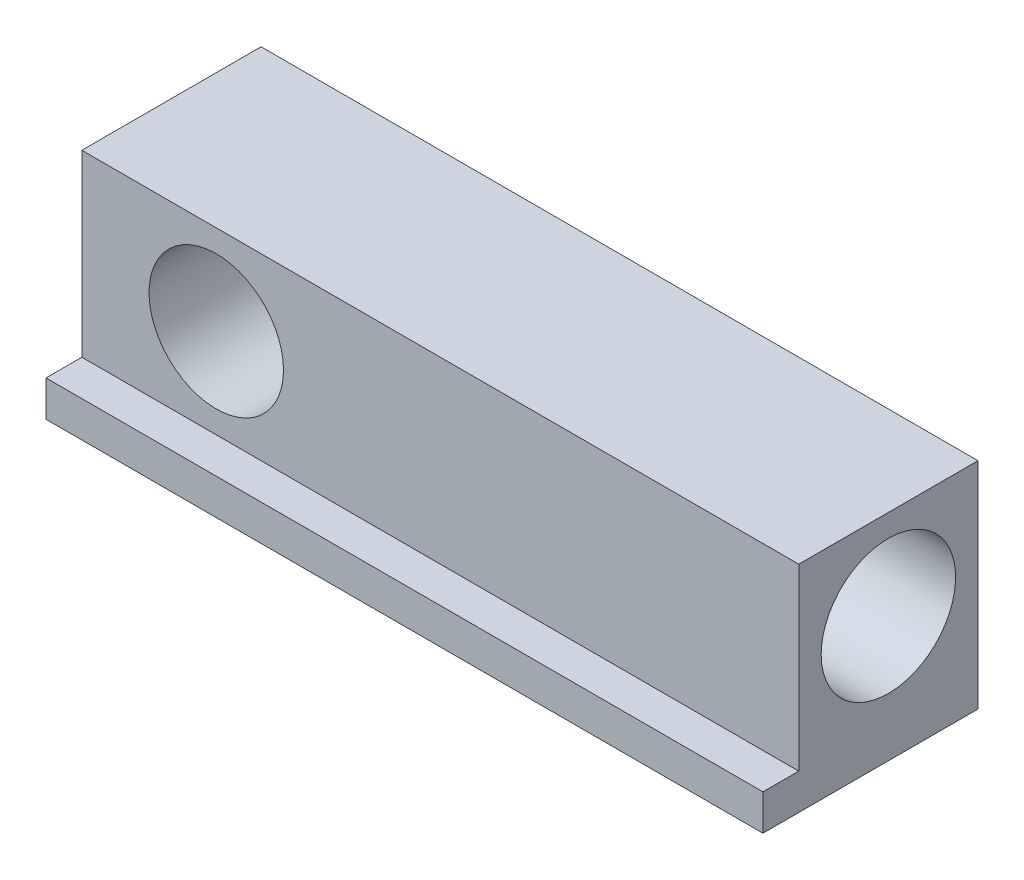
ISO-10303-21;
HEADER;
FILE_DESCRIPTION(('STEP AP214'),'2;1');
FILE_NAME('part.step','',(''),(''),'','','');
FILE_SCHEMA(('AUTOMOTIVE_DESIGN { 1 0 10303 214 1 1 1 1 }'));
ENDSEC;
DATA;
#1=APPLICATION_CONTEXT('core data for automotive mechanical design processes');
#2=APPLICATION_PROTOCOL_DEFINITION('international standard','automotive_design',2000,#1);
#3=PRODUCT_CONTEXT('',#1,'mechanical');
#4=PRODUCT('Part','Part','',(#3));
#5=PRODUCT_RELATED_PRODUCT_CATEGORY('part','',(#4));
#6=PRODUCT_DEFINITION_FORMATION('','',#4);
#7=PRODUCT_DEFINITION_CONTEXT('part definition',#1,'design');
#8=PRODUCT_DEFINITION('design','',#6,#7);
#9=PRODUCT_DEFINITION_SHAPE('','',#8);
#10=(LENGTH_UNIT() NAMED_UNIT(*) SI_UNIT(.MILLI.,.METRE.));
#11=(NAMED_UNIT(*) PLANE_ANGLE_UNIT() SI_UNIT($,.RADIAN.));
#12=(NAMED_UNIT(*) SI_UNIT($,.STERADIAN.) SOLID_ANGLE_UNIT());
#13=UNCERTAINTY_MEASURE_WITH_UNIT(LENGTH_MEASURE(1.E-05),#10,'distance_accuracy_value','');
#14=(GEOMETRIC_REPRESENTATION_CONTEXT(3) GLOBAL_UNCERTAINTY_ASSIGNED_CONTEXT((#13)) GLOBAL_UNIT_ASSIGNED_CONTEXT((#10,
#11,#12)) REPRESENTATION_CONTEXT('',''));
#15=CARTESIAN_POINT('',(0.,0.,0.));
#16=DIRECTION('',(0.,0.,1.));
#17=DIRECTION('',(1.,0.,0.));
#18=AXIS2_PLACEMENT_3D('',#15,#16,#17);
#19=CARTESIAN_POINT('',(40.,-10.,10.));
#20=DIRECTION('',(0.,0.,-1.));
#21=DIRECTION('',(1.,0.,0.));
#22=AXIS2_PLACEMENT_3D('',#19,#20,#21);
#23=PLANE('',#22);
#24=CARTESIAN_POINT('',(-25.,0.,10.));
#25=DIRECTION('',(0.,0.,1.));
#26=DIRECTION('',(1.,0.,0.));
#27=AXIS2_PLACEMENT_3D('',#24,#25,#26);
#28=CIRCLE('',#27,7.5);
#29=CARTESIAN_POINT('',(-17.5,0.,10.));
#30=VERTEX_POINT('',#29);
#31=EDGE_CURVE('E98',#30,#30,#28,.T.);
#32=ORIENTED_EDGE('',*,*,#31,.F.);
#33=EDGE_LOOP('',(#32));
#34=FACE_BOUND('',#33,.T.);
#35=DIRECTION('',(0.,1.,0.));
#36=VECTOR('',#35,1.);
#37=CARTESIAN_POINT('',(-40.,-10.,10.));
#38=LINE('',#37,#36);
#39=CARTESIAN_POINT('',(-40.,-10.,10.));
#40=VERTEX_POINT('',#39);
#41=CARTESIAN_POINT('',(-40.,10.,10.));
#42=VERTEX_POINT('',#41);
#43=EDGE_CURVE('E76',#40,#42,#38,.T.);
#44=ORIENTED_EDGE('',*,*,#43,.F.);
#45=DIRECTION('',(-1.,0.,0.));
#46=VECTOR('',#45,1.);
#47=CARTESIAN_POINT('',(40.,-10.,10.));
#48=LINE('',#47,#46);
#49=CARTESIAN_POINT('',(40.,-10.,10.));
#50=VERTEX_POINT('',#49);
#51=EDGE_CURVE('E88',#50,#40,#48,.T.);
#52=ORIENTED_EDGE('',*,*,#51,.F.);
#53=DIRECTION('',(0.,1.,0.));
#54=VECTOR('',#53,1.);
#55=CARTESIAN_POINT('',(40.,-10.,10.));
#56=LINE('',#55,#54);
#57=CARTESIAN_POINT('',(40.,10.,10.));
#58=VERTEX_POINT('',#57);
#59=EDGE_CURVE('E107',#50,#58,#56,.T.);
#60=ORIENTED_EDGE('',*,*,#59,.T.);
#61=DIRECTION('',(-1.,0.,0.));
#62=VECTOR('',#61,1.);
#63=CARTESIAN_POINT('',(40.,10.,10.));
#64=LINE('',#63,#62);
#65=EDGE_CURVE('E11',#58,#42,#64,.T.);
#66=ORIENTED_EDGE('',*,*,#65,.T.);
#67=EDGE_LOOP('',(#44,#52,#60,#66));
#68=FACE_BOUND('',#67,.T.);
#69=ADVANCED_FACE('F35',(#34,#68),#23,.F.);
#70=CARTESIAN_POINT('',(40.,10.,-10.));
#71=DIRECTION('',(0.,-1.,0.));
#72=DIRECTION('',(0.,0.,1.));
#73=AXIS2_PLACEMENT_3D('',#70,#71,#72);
#74=PLANE('',#73);
#75=DIRECTION('',(0.,0.,-1.));
#76=VECTOR('',#75,1.);
#77=CARTESIAN_POINT('',(-40.,10.,-10.));
#78=LINE('',#77,#76);
#79=CARTESIAN_POINT('',(-40.,10.,-10.));
#80=VERTEX_POINT('',#79);
#81=EDGE_CURVE('E97',#42,#80,#78,.T.);
#82=ORIENTED_EDGE('',*,*,#81,.F.);
#83=ORIENTED_EDGE('',*,*,#65,.F.);
#84=DIRECTION('',(0.,0.,-1.));
#85=VECTOR('',#84,1.);
#86=CARTESIAN_POINT('',(40.,10.,-10.));
#87=LINE('',#86,#85);
#88=CARTESIAN_POINT('',(40.,10.,-10.));
#89=VERTEX_POINT('',#88);
#90=EDGE_CURVE('E111',#58,#89,#87,.T.);
#91=ORIENTED_EDGE('',*,*,#90,.T.);
#92=DIRECTION('',(-1.,0.,0.));
#93=VECTOR('',#92,1.);
#94=CARTESIAN_POINT('',(40.,10.,-10.));
#95=LINE('',#94,#93);
#96=EDGE_CURVE('E43',#89,#80,#95,.T.);
#97=ORIENTED_EDGE('',*,*,#96,.T.);
#98=EDGE_LOOP('',(#82,#83,#91,#97));
#99=FACE_BOUND('',#98,.T.);
#100=ADVANCED_FACE('F110',(#99),#74,.F.);
#101=CARTESIAN_POINT('',(40.,-10.,-10.));
#102=DIRECTION('',(0.,0.,1.));
#103=DIRECTION('',(-1.,0.,0.));
#104=AXIS2_PLACEMENT_3D('',#101,#102,#103);
#105=PLANE('',#104);
#106=CARTESIAN_POINT('',(-25.,0.,-10.));
#107=DIRECTION('',(0.,0.,1.));
#108=DIRECTION('',(1.,0.,0.));
#109=AXIS2_PLACEMENT_3D('',#106,#107,#108);
#110=CIRCLE('',#109,7.5);
#111=CARTESIAN_POINT('',(-17.5,0.,-10.));
#112=VERTEX_POINT('',#111);
#113=EDGE_CURVE('E102',#112,#112,#110,.T.);
#114=ORIENTED_EDGE('',*,*,#113,.T.);
#115=EDGE_LOOP('',(#114));
#116=FACE_BOUND('',#115,.T.);
#117=DIRECTION('',(0.,-1.,0.));
#118=VECTOR('',#117,1.);
#119=CARTESIAN_POINT('',(-40.,-10.,-10.));
#120=LINE('',#119,#118);
#121=CARTESIAN_POINT('',(-40.,-14.,-10.));
#122=VERTEX_POINT('',#121);
#123=EDGE_CURVE('E64',#80,#122,#120,.T.);
#124=ORIENTED_EDGE('',*,*,#123,.F.);
#125=ORIENTED_EDGE('',*,*,#96,.F.);
#126=DIRECTION('',(0.,-1.,0.));
#127=VECTOR('',#126,1.);
#128=CARTESIAN_POINT('',(40.,-10.,-10.));
#129=LINE('',#128,#127);
#130=CARTESIAN_POINT('',(40.,-14.,-10.));
#131=VERTEX_POINT('',#130);
#132=EDGE_CURVE('E51',#89,#131,#129,.T.);
#133=ORIENTED_EDGE('',*,*,#132,.T.);
#134=DIRECTION('',(-1.,0.,0.));
#135=VECTOR('',#134,1.);
#136=CARTESIAN_POINT('',(-40.,-14.,-10.));
#137=LINE('',#136,#135);
#138=EDGE_CURVE('E140',#131,#122,#137,.T.);
#139=ORIENTED_EDGE('',*,*,#138,.T.);
#140=EDGE_LOOP('',(#124,#125,#133,#139));
#141=FACE_BOUND('',#140,.T.);
#142=ADVANCED_FACE('F151',(#116,#141),#105,.F.);
#143=CARTESIAN_POINT('',(40.,0.,0.));
#144=DIRECTION('',(-1.,0.,0.));
#145=DIRECTION('',(0.,0.,-1.));
#146=AXIS2_PLACEMENT_3D('',#143,#144,#145);
#147=PLANE('',#146);
#148=CARTESIAN_POINT('',(40.,0.,0.));
#149=DIRECTION('',(-1.,0.,0.));
#150=DIRECTION('',(0.,0.,1.));
#151=AXIS2_PLACEMENT_3D('',#148,#149,#150);
#152=CIRCLE('',#151,7.5);
#153=CARTESIAN_POINT('',(40.,0.,7.5));
#154=VERTEX_POINT('',#153);
#155=EDGE_CURVE('E194',#154,#154,#152,.T.);
#156=ORIENTED_EDGE('',*,*,#155,.T.);
#157=EDGE_LOOP('',(#156));
#158=FACE_BOUND('',#157,.T.);
#159=ORIENTED_EDGE('',*,*,#59,.F.);
#160=DIRECTION('',(0.,0.,-1.));
#161=VECTOR('',#160,1.);
#162=CARTESIAN_POINT('',(40.,-10.,-10.));
#163=LINE('',#162,#161);
#164=CARTESIAN_POINT('',(40.,-10.,14.));
#165=VERTEX_POINT('',#164);
#166=EDGE_CURVE('E91',#165,#50,#163,.T.);
#167=ORIENTED_EDGE('',*,*,#166,.F.);
#168=DIRECTION('',(0.,1.,0.));
#169=VECTOR('',#168,1.);
#170=CARTESIAN_POINT('',(40.,-14.,14.));
#171=LINE('',#170,#169);
#172=CARTESIAN_POINT('',(40.,-14.,14.));
#173=VERTEX_POINT('',#172);
#174=EDGE_CURVE('E136',#173,#165,#171,.T.);
#175=ORIENTED_EDGE('',*,*,#174,.F.);
#176=DIRECTION('',(0.,0.,-1.));
#177=VECTOR('',#176,1.);
#178=CARTESIAN_POINT('',(40.,-14.,-10.));
#179=LINE('',#178,#177);
#180=EDGE_CURVE('E137',#173,#131,#179,.T.);
#181=ORIENTED_EDGE('',*,*,#180,.T.);
#182=ORIENTED_EDGE('',*,*,#132,.F.);
#183=ORIENTED_EDGE('',*,*,#90,.F.);
#184=EDGE_LOOP('',(#159,#167,#175,#181,#182,#183));
#185=FACE_BOUND('',#184,.T.);
#186=ADVANCED_FACE('F142',(#158,#185),#147,.F.);
#187=CARTESIAN_POINT('',(-40.,0.,0.));
#188=DIRECTION('',(-1.,0.,0.));
#189=DIRECTION('',(0.,0.,-1.));
#190=AXIS2_PLACEMENT_3D('',#187,#188,#189);
#191=PLANE('',#190);
#192=ORIENTED_EDGE('',*,*,#43,.T.);
#193=ORIENTED_EDGE('',*,*,#81,.T.);
#194=ORIENTED_EDGE('',*,*,#123,.T.);
#195=DIRECTION('',(0.,0.,1.));
#196=VECTOR('',#195,1.);
#197=CARTESIAN_POINT('',(-40.,-14.,-10.));
#198=LINE('',#197,#196);
#199=CARTESIAN_POINT('',(-40.,-14.,14.));
#200=VERTEX_POINT('',#199);
#201=EDGE_CURVE('E115',#122,#200,#198,.T.);
#202=ORIENTED_EDGE('',*,*,#201,.T.);
#203=DIRECTION('',(0.,1.,0.));
#204=VECTOR('',#203,1.);
#205=CARTESIAN_POINT('',(-40.,-14.,14.));
#206=LINE('',#205,#204);
#207=CARTESIAN_POINT('',(-40.,-10.,14.));
#208=VERTEX_POINT('',#207);
#209=EDGE_CURVE('E80',#200,#208,#206,.T.);
#210=ORIENTED_EDGE('',*,*,#209,.T.);
#211=DIRECTION('',(0.,0.,1.));
#212=VECTOR('',#211,1.);
#213=CARTESIAN_POINT('',(-40.,-10.,-10.));
#214=LINE('',#213,#212);
#215=EDGE_CURVE('E71',#40,#208,#214,.T.);
#216=ORIENTED_EDGE('',*,*,#215,.F.);
#217=EDGE_LOOP('',(#192,#193,#194,#202,#210,#216));
#218=FACE_BOUND('',#217,.T.);
#219=ADVANCED_FACE('F73',(#218),#191,.T.);
#220=CARTESIAN_POINT('',(-25.,0.,10.));
#221=DIRECTION('',(0.,0.,-1.));
#222=DIRECTION('',(1.,0.,0.));
#223=AXIS2_PLACEMENT_3D('',#220,#221,#222);
#224=CYLINDRICAL_SURFACE('',#223,7.5);
#225=ORIENTED_EDGE('',*,*,#31,.T.);
#226=EDGE_LOOP('',(#225));
#227=FACE_BOUND('',#226,.T.);
#228=ORIENTED_EDGE('',*,*,#113,.F.);
#229=EDGE_LOOP('',(#228));
#230=FACE_BOUND('',#229,.T.);
#231=ADVANCED_FACE('F168',(#227,#230),#224,.F.);
#232=CARTESIAN_POINT('',(-40.,-14.,14.));
#233=DIRECTION('',(0.,0.,-1.));
#234=DIRECTION('',(1.,0.,0.));
#235=AXIS2_PLACEMENT_3D('',#232,#233,#234);
#236=PLANE('',#235);
#237=DIRECTION('',(1.,0.,0.));
#238=VECTOR('',#237,1.);
#239=CARTESIAN_POINT('',(-40.,-10.,14.));
#240=LINE('',#239,#238);
#241=EDGE_CURVE('E83',#208,#165,#240,.T.);
#242=ORIENTED_EDGE('',*,*,#241,.F.);
#243=ORIENTED_EDGE('',*,*,#209,.F.);
#244=DIRECTION('',(1.,0.,0.));
#245=VECTOR('',#244,1.);
#246=CARTESIAN_POINT('',(-40.,-14.,14.));
#247=LINE('',#246,#245);
#248=EDGE_CURVE('E132',#200,#173,#247,.T.);
#249=ORIENTED_EDGE('',*,*,#248,.T.);
#250=ORIENTED_EDGE('',*,*,#174,.T.);
#251=EDGE_LOOP('',(#242,#243,#249,#250));
#252=FACE_BOUND('',#251,.T.);
#253=ADVANCED_FACE('F134',(#252),#236,.F.);
#254=CARTESIAN_POINT('',(0.,-14.,0.));
#255=DIRECTION('',(0.,-1.,0.));
#256=DIRECTION('',(0.,0.,1.));
#257=AXIS2_PLACEMENT_3D('',#254,#255,#256);
#258=PLANE('',#257);
#259=ORIENTED_EDGE('',*,*,#201,.F.);
#260=ORIENTED_EDGE('',*,*,#138,.F.);
#261=ORIENTED_EDGE('',*,*,#180,.F.);
#262=ORIENTED_EDGE('',*,*,#248,.F.);
#263=EDGE_LOOP('',(#259,#260,#261,#262));
#264=FACE_BOUND('',#263,.T.);
#265=ADVANCED_FACE('F139',(#264),#258,.T.);
#266=CARTESIAN_POINT('',(0.,-10.,0.));
#267=DIRECTION('',(0.,-1.,0.));
#268=DIRECTION('',(0.,0.,1.));
#269=AXIS2_PLACEMENT_3D('',#266,#267,#268);
#270=PLANE('',#269);
#271=ORIENTED_EDGE('',*,*,#51,.T.);
#272=ORIENTED_EDGE('',*,*,#215,.T.);
#273=ORIENTED_EDGE('',*,*,#241,.T.);
#274=ORIENTED_EDGE('',*,*,#166,.T.);
#275=EDGE_LOOP('',(#271,#272,#273,#274));
#276=FACE_BOUND('',#275,.T.);
#277=ADVANCED_FACE('F89',(#276),#270,.F.);
#278=CARTESIAN_POINT('',(0.,0.,0.));
#279=DIRECTION('',(1.,0.,0.));
#280=DIRECTION('',(0.,0.,1.));
#281=AXIS2_PLACEMENT_3D('',#278,#279,#280);
#282=CYLINDRICAL_SURFACE('',#281,7.5);
#283=CARTESIAN_POINT('',(0.,0.,0.));
#284=DIRECTION('',(-1.,0.,0.));
#285=DIRECTION('',(0.,0.,1.));
#286=AXIS2_PLACEMENT_3D('',#283,#284,#285);
#287=CIRCLE('',#286,7.5);
#288=CARTESIAN_POINT('',(0.,0.,7.5));
#289=VERTEX_POINT('',#288);
#290=EDGE_CURVE('E84',#289,#289,#287,.T.);
#291=ORIENTED_EDGE('',*,*,#290,.T.);
#292=EDGE_LOOP('',(#291));
#293=FACE_BOUND('',#292,.T.);
#294=ORIENTED_EDGE('',*,*,#155,.F.);
#295=EDGE_LOOP('',(#294));
#296=FACE_BOUND('',#295,.T.);
#297=ADVANCED_FACE('F181',(#293,#296),#282,.F.);
#298=CARTESIAN_POINT('',(0.,0.,0.));
#299=DIRECTION('',(1.,0.,0.));
#300=DIRECTION('',(0.,0.,1.));
#301=AXIS2_PLACEMENT_3D('',#298,#299,#300);
#302=PLANE('',#301);
#303=ORIENTED_EDGE('',*,*,#290,.F.);
#304=EDGE_LOOP('',(#303));
#305=FACE_BOUND('',#304,.T.);
#306=ADVANCED_FACE('F186',(#305),#302,.T.);
#307=CLOSED_SHELL('',(#69,#100,#142,#186,#219,#231,#253,#265,#277,#297,#306));
#308=MANIFOLD_SOLID_BREP('B2',#307);
#309=ADVANCED_BREP_SHAPE_REPRESENTATION('',(#18,#308),#14);
#310=SHAPE_DEFINITION_REPRESENTATION(#9,#309);
ENDSEC;
END-ISO-10303-21;
